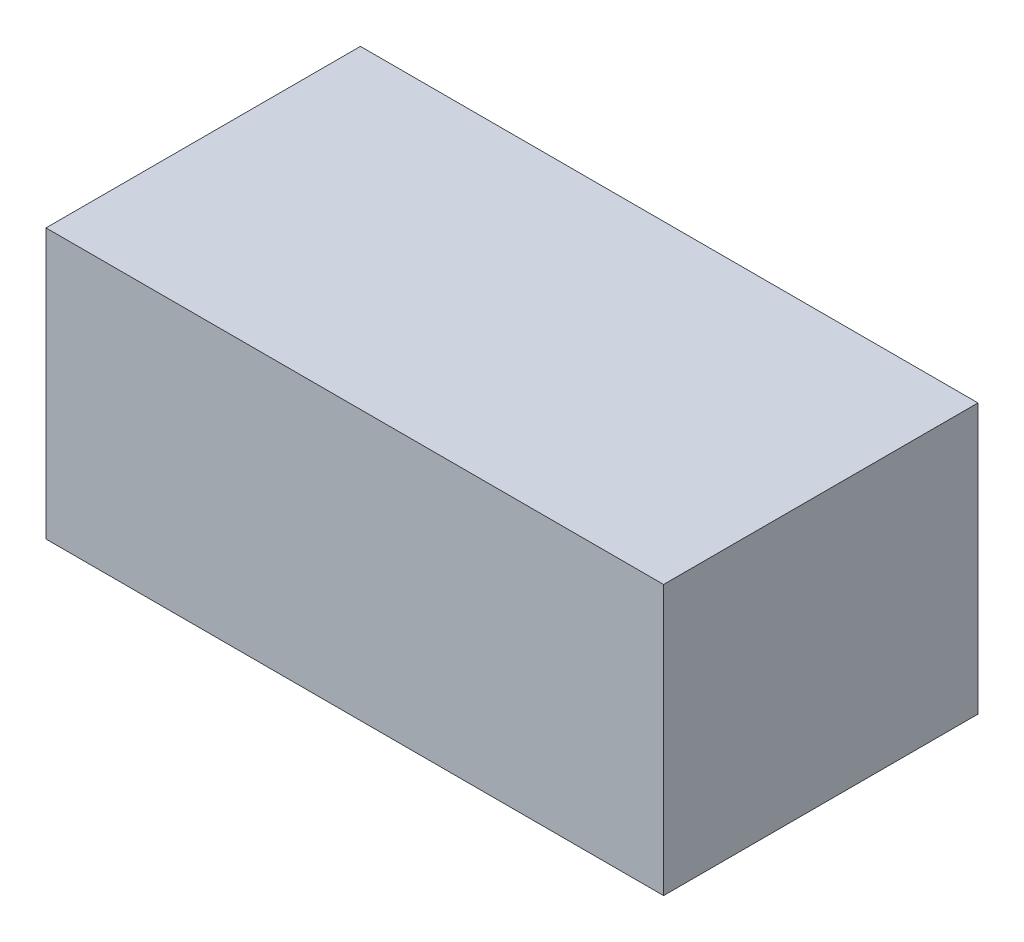
ISO-10303-21;
HEADER;
FILE_DESCRIPTION(('STEP AP214'),'2;1');
FILE_NAME('part.step','',(''),(''),'','','');
FILE_SCHEMA(('AUTOMOTIVE_DESIGN { 1 0 10303 214 1 1 1 1 }'));
ENDSEC;
DATA;
#1=APPLICATION_CONTEXT('core data for automotive mechanical design processes');
#2=APPLICATION_PROTOCOL_DEFINITION('international standard','automotive_design',2000,#1);
#3=PRODUCT_CONTEXT('',#1,'mechanical');
#4=PRODUCT('Part','Part','',(#3));
#5=PRODUCT_RELATED_PRODUCT_CATEGORY('part','',(#4));
#6=PRODUCT_DEFINITION_FORMATION('','',#4);
#7=PRODUCT_DEFINITION_CONTEXT('part definition',#1,'design');
#8=PRODUCT_DEFINITION('design','',#6,#7);
#9=PRODUCT_DEFINITION_SHAPE('','',#8);
#10=(LENGTH_UNIT() NAMED_UNIT(*) SI_UNIT(.MILLI.,.METRE.));
#11=(NAMED_UNIT(*) PLANE_ANGLE_UNIT() SI_UNIT($,.RADIAN.));
#12=(NAMED_UNIT(*) SI_UNIT($,.STERADIAN.) SOLID_ANGLE_UNIT());
#13=UNCERTAINTY_MEASURE_WITH_UNIT(LENGTH_MEASURE(1.E-05),#10,'distance_accuracy_value','');
#14=(GEOMETRIC_REPRESENTATION_CONTEXT(3) GLOBAL_UNCERTAINTY_ASSIGNED_CONTEXT((#13)) GLOBAL_UNIT_ASSIGNED_CONTEXT((#10,
#11,#12)) REPRESENTATION_CONTEXT('',''));
#15=CARTESIAN_POINT('',(0.,0.,0.));
#16=DIRECTION('',(0.,0.,1.));
#17=DIRECTION('',(1.,0.,0.));
#18=AXIS2_PLACEMENT_3D('',#15,#16,#17);
#19=CARTESIAN_POINT('',(27.5,24.,14.));
#20=DIRECTION('',(-1.,0.,0.));
#21=DIRECTION('',(0.,0.,1.));
#22=AXIS2_PLACEMENT_3D('',#19,#20,#21);
#23=PLANE('',#22);
#24=DIRECTION('',(0.,0.,-1.));
#25=VECTOR('',#24,1.);
#26=CARTESIAN_POINT('',(27.5,0.,14.));
#27=LINE('',#26,#25);
#28=CARTESIAN_POINT('',(27.5,0.,14.));
#29=VERTEX_POINT('',#28);
#30=CARTESIAN_POINT('',(27.5,0.,-14.));
#31=VERTEX_POINT('',#30);
#32=EDGE_CURVE('E104',#29,#31,#27,.T.);
#33=ORIENTED_EDGE('',*,*,#32,.T.);
#34=DIRECTION('',(0.,-1.,0.));
#35=VECTOR('',#34,1.);
#36=CARTESIAN_POINT('',(27.5,24.,-14.));
#37=LINE('',#36,#35);
#38=CARTESIAN_POINT('',(27.5,24.,-14.));
#39=VERTEX_POINT('',#38);
#40=EDGE_CURVE('E11',#39,#31,#37,.T.);
#41=ORIENTED_EDGE('',*,*,#40,.F.);
#42=DIRECTION('',(0.,0.,-1.));
#43=VECTOR('',#42,1.);
#44=CARTESIAN_POINT('',(27.5,24.,14.));
#45=LINE('',#44,#43);
#46=CARTESIAN_POINT('',(27.5,24.,14.));
#47=VERTEX_POINT('',#46);
#48=EDGE_CURVE('E92',#47,#39,#45,.T.);
#49=ORIENTED_EDGE('',*,*,#48,.F.);
#50=DIRECTION('',(0.,-1.,0.));
#51=VECTOR('',#50,1.);
#52=CARTESIAN_POINT('',(27.5,24.,14.));
#53=LINE('',#52,#51);
#54=EDGE_CURVE('E100',#47,#29,#53,.T.);
#55=ORIENTED_EDGE('',*,*,#54,.T.);
#56=EDGE_LOOP('',(#33,#41,#49,#55));
#57=FACE_BOUND('',#56,.T.);
#58=ADVANCED_FACE('F41',(#57),#23,.F.);
#59=CARTESIAN_POINT('',(-27.5,24.,-14.));
#60=DIRECTION('',(0.,0.,1.));
#61=DIRECTION('',(1.,0.,0.));
#62=AXIS2_PLACEMENT_3D('',#59,#60,#61);
#63=PLANE('',#62);
#64=DIRECTION('',(-1.,0.,0.));
#65=VECTOR('',#64,1.);
#66=CARTESIAN_POINT('',(-27.5,0.,-14.));
#67=LINE('',#66,#65);
#68=CARTESIAN_POINT('',(-27.5,0.,-14.));
#69=VERTEX_POINT('',#68);
#70=EDGE_CURVE('E96',#31,#69,#67,.T.);
#71=ORIENTED_EDGE('',*,*,#70,.T.);
#72=DIRECTION('',(0.,-1.,0.));
#73=VECTOR('',#72,1.);
#74=CARTESIAN_POINT('',(-27.5,24.,-14.));
#75=LINE('',#74,#73);
#76=CARTESIAN_POINT('',(-27.5,24.,-14.));
#77=VERTEX_POINT('',#76);
#78=EDGE_CURVE('E49',#77,#69,#75,.T.);
#79=ORIENTED_EDGE('',*,*,#78,.F.);
#80=DIRECTION('',(-1.,0.,0.));
#81=VECTOR('',#80,1.);
#82=CARTESIAN_POINT('',(-27.5,24.,-14.));
#83=LINE('',#82,#81);
#84=EDGE_CURVE('E87',#39,#77,#83,.T.);
#85=ORIENTED_EDGE('',*,*,#84,.F.);
#86=ORIENTED_EDGE('',*,*,#40,.T.);
#87=EDGE_LOOP('',(#71,#79,#85,#86));
#88=FACE_BOUND('',#87,.T.);
#89=ADVANCED_FACE('F95',(#88),#63,.F.);
#90=CARTESIAN_POINT('',(-27.5,24.,14.));
#91=DIRECTION('',(1.,0.,0.));
#92=DIRECTION('',(0.,0.,-1.));
#93=AXIS2_PLACEMENT_3D('',#90,#91,#92);
#94=PLANE('',#93);
#95=DIRECTION('',(0.,0.,1.));
#96=VECTOR('',#95,1.);
#97=CARTESIAN_POINT('',(-27.5,0.,14.));
#98=LINE('',#97,#96);
#99=CARTESIAN_POINT('',(-27.5,0.,14.));
#100=VERTEX_POINT('',#99);
#101=EDGE_CURVE('E74',#69,#100,#98,.T.);
#102=ORIENTED_EDGE('',*,*,#101,.T.);
#103=DIRECTION('',(0.,-1.,0.));
#104=VECTOR('',#103,1.);
#105=CARTESIAN_POINT('',(-27.5,24.,14.));
#106=LINE('',#105,#104);
#107=CARTESIAN_POINT('',(-27.5,24.,14.));
#108=VERTEX_POINT('',#107);
#109=EDGE_CURVE('E97',#108,#100,#106,.T.);
#110=ORIENTED_EDGE('',*,*,#109,.F.);
#111=DIRECTION('',(0.,0.,1.));
#112=VECTOR('',#111,1.);
#113=CARTESIAN_POINT('',(-27.5,24.,14.));
#114=LINE('',#113,#112);
#115=EDGE_CURVE('E90',#77,#108,#114,.T.);
#116=ORIENTED_EDGE('',*,*,#115,.F.);
#117=ORIENTED_EDGE('',*,*,#78,.T.);
#118=EDGE_LOOP('',(#102,#110,#116,#117));
#119=FACE_BOUND('',#118,.T.);
#120=ADVANCED_FACE('F98',(#119),#94,.F.);
#121=CARTESIAN_POINT('',(-27.5,24.,14.));
#122=DIRECTION('',(0.,0.,-1.));
#123=DIRECTION('',(-1.,0.,0.));
#124=AXIS2_PLACEMENT_3D('',#121,#122,#123);
#125=PLANE('',#124);
#126=DIRECTION('',(1.,0.,0.));
#127=VECTOR('',#126,1.);
#128=CARTESIAN_POINT('',(-27.5,0.,14.));
#129=LINE('',#128,#127);
#130=EDGE_CURVE('E80',#100,#29,#129,.T.);
#131=ORIENTED_EDGE('',*,*,#130,.T.);
#132=ORIENTED_EDGE('',*,*,#54,.F.);
#133=DIRECTION('',(1.,0.,0.));
#134=VECTOR('',#133,1.);
#135=CARTESIAN_POINT('',(-27.5,24.,14.));
#136=LINE('',#135,#134);
#137=EDGE_CURVE('E57',#108,#47,#136,.T.);
#138=ORIENTED_EDGE('',*,*,#137,.F.);
#139=ORIENTED_EDGE('',*,*,#109,.T.);
#140=EDGE_LOOP('',(#131,#132,#138,#139));
#141=FACE_BOUND('',#140,.T.);
#142=ADVANCED_FACE('F111',(#141),#125,.F.);
#143=CARTESIAN_POINT('',(0.,24.,0.));
#144=DIRECTION('',(0.,-1.,0.));
#145=DIRECTION('',(0.,0.,-1.));
#146=AXIS2_PLACEMENT_3D('',#143,#144,#145);
#147=PLANE('',#146);
#148=ORIENTED_EDGE('',*,*,#48,.T.);
#149=ORIENTED_EDGE('',*,*,#84,.T.);
#150=ORIENTED_EDGE('',*,*,#115,.T.);
#151=ORIENTED_EDGE('',*,*,#137,.T.);
#152=EDGE_LOOP('',(#148,#149,#150,#151));
#153=FACE_BOUND('',#152,.T.);
#154=ADVANCED_FACE('F88',(#153),#147,.F.);
#155=CARTESIAN_POINT('',(0.,0.,0.));
#156=DIRECTION('',(0.,-1.,0.));
#157=DIRECTION('',(0.,0.,-1.));
#158=AXIS2_PLACEMENT_3D('',#155,#156,#157);
#159=PLANE('',#158);
#160=ORIENTED_EDGE('',*,*,#32,.F.);
#161=ORIENTED_EDGE('',*,*,#130,.F.);
#162=ORIENTED_EDGE('',*,*,#101,.F.);
#163=ORIENTED_EDGE('',*,*,#70,.F.);
#164=EDGE_LOOP('',(#160,#161,#162,#163));
#165=FACE_BOUND('',#164,.T.);
#166=ADVANCED_FACE('F114',(#165),#159,.T.);
#167=CLOSED_SHELL('',(#58,#89,#120,#142,#154,#166));
#168=MANIFOLD_SOLID_BREP('B2',#167);
#169=ADVANCED_BREP_SHAPE_REPRESENTATION('',(#18,#168),#14);
#170=SHAPE_DEFINITION_REPRESENTATION(#9,#169);
ENDSEC;
END-ISO-10303-21;
